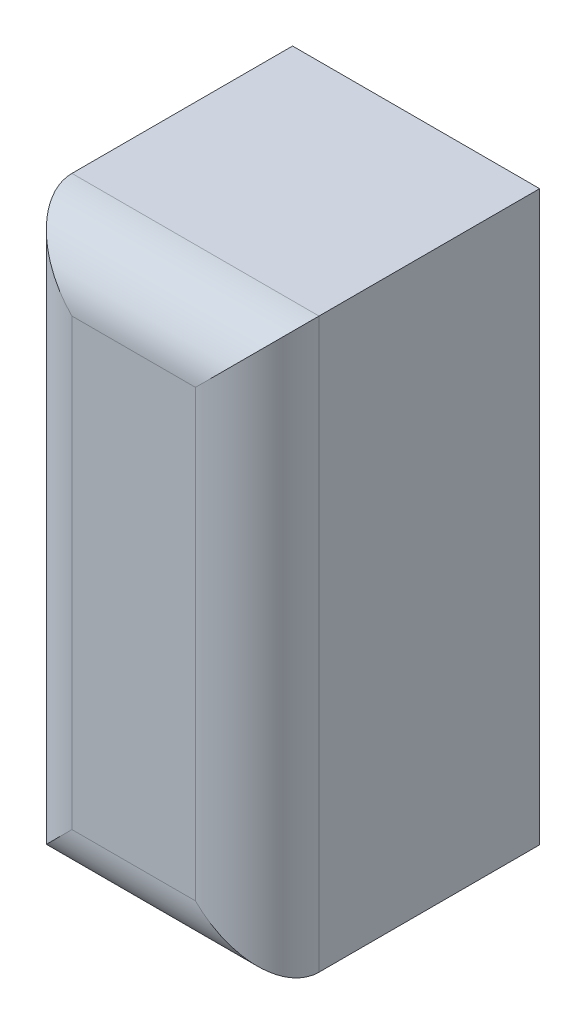
ISO-10303-21;
HEADER;
FILE_DESCRIPTION(('STEP AP214'),'2;1');
FILE_NAME('part.step','',(''),(''),'','','');
FILE_SCHEMA(('AUTOMOTIVE_DESIGN { 1 0 10303 214 1 1 1 1 }'));
ENDSEC;
DATA;
#1=APPLICATION_CONTEXT('core data for automotive mechanical design processes');
#2=APPLICATION_PROTOCOL_DEFINITION('international standard','automotive_design',2000,#1);
#3=PRODUCT_CONTEXT('',#1,'mechanical');
#4=PRODUCT('Part','Part','',(#3));
#5=PRODUCT_RELATED_PRODUCT_CATEGORY('part','',(#4));
#6=PRODUCT_DEFINITION_FORMATION('','',#4);
#7=PRODUCT_DEFINITION_CONTEXT('part definition',#1,'design');
#8=PRODUCT_DEFINITION('design','',#6,#7);
#9=PRODUCT_DEFINITION_SHAPE('','',#8);
#10=(LENGTH_UNIT() NAMED_UNIT(*) SI_UNIT(.MILLI.,.METRE.));
#11=(NAMED_UNIT(*) PLANE_ANGLE_UNIT() SI_UNIT($,.RADIAN.));
#12=(NAMED_UNIT(*) SI_UNIT($,.STERADIAN.) SOLID_ANGLE_UNIT());
#13=UNCERTAINTY_MEASURE_WITH_UNIT(LENGTH_MEASURE(1.E-05),#10,'distance_accuracy_value','');
#14=(GEOMETRIC_REPRESENTATION_CONTEXT(3) GLOBAL_UNCERTAINTY_ASSIGNED_CONTEXT((#13)) GLOBAL_UNIT_ASSIGNED_CONTEXT((#10,
#11,#12)) REPRESENTATION_CONTEXT('',''));
#15=CARTESIAN_POINT('',(0.,0.,0.));
#16=DIRECTION('',(0.,0.,1.));
#17=DIRECTION('',(1.,0.,0.));
#18=AXIS2_PLACEMENT_3D('',#15,#16,#17);
#19=CARTESIAN_POINT('',(9.99999999999999,23.,22.86));
#20=DIRECTION('',(-1.,0.,0.));
#21=DIRECTION('',(0.,-1.,0.));
#22=AXIS2_PLACEMENT_3D('',#19,#20,#21);
#23=PLANE('',#22);
#24=DIRECTION('',(0.,0.,-1.));
#25=VECTOR('',#24,1.);
#26=CARTESIAN_POINT('',(9.99999999999999,23.,22.86));
#27=LINE('',#26,#25);
#28=CARTESIAN_POINT('',(9.99999999999999,23.,17.86));
#29=VERTEX_POINT('',#28);
#30=CARTESIAN_POINT('',(9.99999999999999,23.,0.));
#31=VERTEX_POINT('',#30);
#32=EDGE_CURVE('E98',#29,#31,#27,.T.);
#33=ORIENTED_EDGE('',*,*,#32,.F.);
#34=DIRECTION('',(0.,1.,0.));
#35=VECTOR('',#34,1.);
#36=CARTESIAN_POINT('',(10.,-23.,17.86));
#37=LINE('',#36,#35);
#38=CARTESIAN_POINT('',(10.,-23.,17.86));
#39=VERTEX_POINT('',#38);
#40=EDGE_CURVE('E11',#29,#39,#37,.F.);
#41=ORIENTED_EDGE('',*,*,#40,.T.);
#42=DIRECTION('',(0.,0.,-1.));
#43=VECTOR('',#42,1.);
#44=CARTESIAN_POINT('',(10.,-23.,22.86));
#45=LINE('',#44,#43);
#46=CARTESIAN_POINT('',(10.,-23.,0.));
#47=VERTEX_POINT('',#46);
#48=EDGE_CURVE('E120',#39,#47,#45,.T.);
#49=ORIENTED_EDGE('',*,*,#48,.T.);
#50=DIRECTION('',(0.,1.,0.));
#51=VECTOR('',#50,1.);
#52=CARTESIAN_POINT('',(9.99999999999999,23.,0.));
#53=LINE('',#52,#51);
#54=EDGE_CURVE('E114',#47,#31,#53,.T.);
#55=ORIENTED_EDGE('',*,*,#54,.T.);
#56=EDGE_LOOP('',(#33,#41,#49,#55));
#57=FACE_BOUND('',#56,.T.);
#58=ADVANCED_FACE('F45',(#57),#23,.F.);
#59=CARTESIAN_POINT('',(-10.,23.,22.86));
#60=DIRECTION('',(0.,-1.,0.));
#61=DIRECTION('',(0.,0.,-1.));
#62=AXIS2_PLACEMENT_3D('',#59,#60,#61);
#63=PLANE('',#62);
#64=DIRECTION('',(0.,0.,-1.));
#65=VECTOR('',#64,1.);
#66=CARTESIAN_POINT('',(-10.,23.,22.86));
#67=LINE('',#66,#65);
#68=CARTESIAN_POINT('',(-10.,23.,17.86));
#69=VERTEX_POINT('',#68);
#70=CARTESIAN_POINT('',(-10.,23.,0.));
#71=VERTEX_POINT('',#70);
#72=EDGE_CURVE('E108',#69,#71,#67,.T.);
#73=ORIENTED_EDGE('',*,*,#72,.F.);
#74=DIRECTION('',(-1.,0.,0.));
#75=VECTOR('',#74,1.);
#76=CARTESIAN_POINT('',(9.99999999999999,23.,17.86));
#77=LINE('',#76,#75);
#78=EDGE_CURVE('E55',#69,#29,#77,.F.);
#79=ORIENTED_EDGE('',*,*,#78,.T.);
#80=ORIENTED_EDGE('',*,*,#32,.T.);
#81=DIRECTION('',(-1.,0.,0.));
#82=VECTOR('',#81,1.);
#83=CARTESIAN_POINT('',(-10.,23.,0.));
#84=LINE('',#83,#82);
#85=EDGE_CURVE('E101',#31,#71,#84,.T.);
#86=ORIENTED_EDGE('',*,*,#85,.T.);
#87=EDGE_LOOP('',(#73,#79,#80,#86));
#88=FACE_BOUND('',#87,.T.);
#89=ADVANCED_FACE('F100',(#88),#63,.F.);
#90=CARTESIAN_POINT('',(-10.,23.,22.86));
#91=DIRECTION('',(1.,0.,0.));
#92=DIRECTION('',(0.,1.,0.));
#93=AXIS2_PLACEMENT_3D('',#90,#91,#92);
#94=PLANE('',#93);
#95=DIRECTION('',(0.,0.,-1.));
#96=VECTOR('',#95,1.);
#97=CARTESIAN_POINT('',(-9.99999999999999,-23.,22.86));
#98=LINE('',#97,#96);
#99=CARTESIAN_POINT('',(-9.99999999999999,-23.,17.86));
#100=VERTEX_POINT('',#99);
#101=CARTESIAN_POINT('',(-9.99999999999999,-23.,0.));
#102=VERTEX_POINT('',#101);
#103=EDGE_CURVE('E140',#100,#102,#98,.T.);
#104=ORIENTED_EDGE('',*,*,#103,.F.);
#105=DIRECTION('',(0.,-1.,0.));
#106=VECTOR('',#105,1.);
#107=CARTESIAN_POINT('',(-10.,23.,17.86));
#108=LINE('',#107,#106);
#109=EDGE_CURVE('E70',#100,#69,#108,.F.);
#110=ORIENTED_EDGE('',*,*,#109,.T.);
#111=ORIENTED_EDGE('',*,*,#72,.T.);
#112=DIRECTION('',(0.,-1.,0.));
#113=VECTOR('',#112,1.);
#114=CARTESIAN_POINT('',(-10.,23.,0.));
#115=LINE('',#114,#113);
#116=EDGE_CURVE('E116',#71,#102,#115,.T.);
#117=ORIENTED_EDGE('',*,*,#116,.T.);
#118=EDGE_LOOP('',(#104,#110,#111,#117));
#119=FACE_BOUND('',#118,.T.);
#120=ADVANCED_FACE('F219',(#119),#94,.F.);
#121=CARTESIAN_POINT('',(-9.99999999999999,-23.,22.86));
#122=DIRECTION('',(0.,1.,0.));
#123=DIRECTION('',(0.,0.,1.));
#124=AXIS2_PLACEMENT_3D('',#121,#122,#123);
#125=PLANE('',#124);
#126=ORIENTED_EDGE('',*,*,#48,.F.);
#127=DIRECTION('',(1.,0.,0.));
#128=VECTOR('',#127,1.);
#129=CARTESIAN_POINT('',(-9.99999999999999,-23.,17.86));
#130=LINE('',#129,#128);
#131=EDGE_CURVE('E157',#39,#100,#130,.F.);
#132=ORIENTED_EDGE('',*,*,#131,.T.);
#133=ORIENTED_EDGE('',*,*,#103,.T.);
#134=DIRECTION('',(1.,0.,0.));
#135=VECTOR('',#134,1.);
#136=CARTESIAN_POINT('',(-9.99999999999999,-23.,0.));
#137=LINE('',#136,#135);
#138=EDGE_CURVE('E135',#102,#47,#137,.T.);
#139=ORIENTED_EDGE('',*,*,#138,.T.);
#140=EDGE_LOOP('',(#126,#132,#133,#139));
#141=FACE_BOUND('',#140,.T.);
#142=ADVANCED_FACE('F209',(#141),#125,.F.);
#143=CARTESIAN_POINT('',(0.,0.,22.86));
#144=DIRECTION('',(0.,0.,1.));
#145=DIRECTION('',(1.,0.,0.));
#146=AXIS2_PLACEMENT_3D('',#143,#144,#145);
#147=PLANE('',#146);
#148=DIRECTION('',(0.,-1.,0.));
#149=VECTOR('',#148,1.);
#150=CARTESIAN_POINT('',(-4.99999999999999,-23.,22.86));
#151=LINE('',#150,#149);
#152=CARTESIAN_POINT('',(-5.,18.,22.86));
#153=VERTEX_POINT('',#152);
#154=CARTESIAN_POINT('',(-5.,-18.,22.86));
#155=VERTEX_POINT('',#154);
#156=EDGE_CURVE('E150',#153,#155,#151,.T.);
#157=ORIENTED_EDGE('',*,*,#156,.T.);
#158=DIRECTION('',(1.,0.,0.));
#159=VECTOR('',#158,1.);
#160=CARTESIAN_POINT('',(10.,-18.,22.86));
#161=LINE('',#160,#159);
#162=CARTESIAN_POINT('',(5.,-18.,22.86));
#163=VERTEX_POINT('',#162);
#164=EDGE_CURVE('E153',#155,#163,#161,.T.);
#165=ORIENTED_EDGE('',*,*,#164,.T.);
#166=DIRECTION('',(0.,1.,0.));
#167=VECTOR('',#166,1.);
#168=CARTESIAN_POINT('',(4.99999999999999,23.,22.86));
#169=LINE('',#168,#167);
#170=CARTESIAN_POINT('',(5.,18.,22.86));
#171=VERTEX_POINT('',#170);
#172=EDGE_CURVE('E107',#163,#171,#169,.T.);
#173=ORIENTED_EDGE('',*,*,#172,.T.);
#174=DIRECTION('',(-1.,0.,0.));
#175=VECTOR('',#174,1.);
#176=CARTESIAN_POINT('',(-10.,18.,22.86));
#177=LINE('',#176,#175);
#178=EDGE_CURVE('E147',#171,#153,#177,.T.);
#179=ORIENTED_EDGE('',*,*,#178,.T.);
#180=EDGE_LOOP('',(#157,#165,#173,#179));
#181=FACE_BOUND('',#180,.T.);
#182=ADVANCED_FACE('F200',(#181),#147,.T.);
#183=CARTESIAN_POINT('',(0.,0.,0.));
#184=DIRECTION('',(0.,0.,1.));
#185=DIRECTION('',(1.,0.,0.));
#186=AXIS2_PLACEMENT_3D('',#183,#184,#185);
#187=PLANE('',#186);
#188=CARTESIAN_POINT('',(0.,12.5,0.));
#189=DIRECTION('',(0.,0.,-1.));
#190=DIRECTION('',(-1.,0.,0.));
#191=AXIS2_PLACEMENT_3D('',#188,#189,#190);
#192=CIRCLE('',#191,6.05);
#193=CARTESIAN_POINT('',(-6.04999999999999,12.5,0.));
#194=VERTEX_POINT('',#193);
#195=EDGE_CURVE('E127',#194,#194,#192,.T.);
#196=ORIENTED_EDGE('',*,*,#195,.F.);
#197=EDGE_LOOP('',(#196));
#198=FACE_BOUND('',#197,.T.);
#199=CARTESIAN_POINT('',(0.,-12.5,0.));
#200=DIRECTION('',(0.,0.,-1.));
#201=DIRECTION('',(-1.,0.,0.));
#202=AXIS2_PLACEMENT_3D('',#199,#200,#201);
#203=CIRCLE('',#202,6.05);
#204=CARTESIAN_POINT('',(-6.05,-12.5,0.));
#205=VERTEX_POINT('',#204);
#206=EDGE_CURVE('E183',#205,#205,#203,.T.);
#207=ORIENTED_EDGE('',*,*,#206,.F.);
#208=EDGE_LOOP('',(#207));
#209=FACE_BOUND('',#208,.T.);
#210=ORIENTED_EDGE('',*,*,#54,.F.);
#211=ORIENTED_EDGE('',*,*,#138,.F.);
#212=ORIENTED_EDGE('',*,*,#116,.F.);
#213=ORIENTED_EDGE('',*,*,#85,.F.);
#214=EDGE_LOOP('',(#210,#211,#212,#213));
#215=FACE_BOUND('',#214,.T.);
#216=ADVANCED_FACE('F112',(#198,#209,#215),#187,.F.);
#217=CARTESIAN_POINT('',(0.,-12.5,17.78));
#218=DIRECTION('',(0.,0.,-1.));
#219=DIRECTION('',(-1.,0.,0.));
#220=AXIS2_PLACEMENT_3D('',#217,#218,#219);
#221=CYLINDRICAL_SURFACE('',#220,6.05);
#222=CARTESIAN_POINT('',(0.,-12.5,17.78));
#223=DIRECTION('',(0.,0.,-1.));
#224=DIRECTION('',(-1.,0.,0.));
#225=AXIS2_PLACEMENT_3D('',#222,#223,#224);
#226=CIRCLE('',#225,6.05);
#227=CARTESIAN_POINT('',(-6.05,-12.5,17.78));
#228=VERTEX_POINT('',#227);
#229=EDGE_CURVE('E130',#228,#228,#226,.T.);
#230=ORIENTED_EDGE('',*,*,#229,.F.);
#231=EDGE_LOOP('',(#230));
#232=FACE_BOUND('',#231,.T.);
#233=ORIENTED_EDGE('',*,*,#206,.T.);
#234=EDGE_LOOP('',(#233));
#235=FACE_BOUND('',#234,.T.);
#236=ADVANCED_FACE('F199',(#232,#235),#221,.F.);
#237=CARTESIAN_POINT('',(0.,-12.5,17.78));
#238=DIRECTION('',(0.,0.,-1.));
#239=DIRECTION('',(-1.,0.,0.));
#240=AXIS2_PLACEMENT_3D('',#237,#238,#239);
#241=PLANE('',#240);
#242=ORIENTED_EDGE('',*,*,#229,.T.);
#243=EDGE_LOOP('',(#242));
#244=FACE_BOUND('',#243,.T.);
#245=ADVANCED_FACE('F205',(#244),#241,.T.);
#246=CARTESIAN_POINT('',(0.,12.5,17.78));
#247=DIRECTION('',(0.,0.,-1.));
#248=DIRECTION('',(-1.,0.,0.));
#249=AXIS2_PLACEMENT_3D('',#246,#247,#248);
#250=CYLINDRICAL_SURFACE('',#249,6.05);
#251=CARTESIAN_POINT('',(0.,12.5,17.78));
#252=DIRECTION('',(0.,0.,-1.));
#253=DIRECTION('',(-1.,0.,0.));
#254=AXIS2_PLACEMENT_3D('',#251,#252,#253);
#255=CIRCLE('',#254,6.05);
#256=CARTESIAN_POINT('',(-6.04999999999999,12.5,17.78));
#257=VERTEX_POINT('',#256);
#258=EDGE_CURVE('E123',#257,#257,#255,.T.);
#259=ORIENTED_EDGE('',*,*,#258,.F.);
#260=EDGE_LOOP('',(#259));
#261=FACE_BOUND('',#260,.T.);
#262=ORIENTED_EDGE('',*,*,#195,.T.);
#263=EDGE_LOOP('',(#262));
#264=FACE_BOUND('',#263,.T.);
#265=ADVANCED_FACE('F195',(#261,#264),#250,.F.);
#266=CARTESIAN_POINT('',(0.,12.5,17.78));
#267=DIRECTION('',(0.,0.,-1.));
#268=DIRECTION('',(-1.,0.,0.));
#269=AXIS2_PLACEMENT_3D('',#266,#267,#268);
#270=PLANE('',#269);
#271=ORIENTED_EDGE('',*,*,#258,.T.);
#272=EDGE_LOOP('',(#271));
#273=FACE_BOUND('',#272,.T.);
#274=ADVANCED_FACE('F234',(#273),#270,.T.);
#275=CARTESIAN_POINT('',(0.,18.,17.86));
#276=DIRECTION('',(1.,0.,0.));
#277=DIRECTION('',(0.,0.,-1.));
#278=AXIS2_PLACEMENT_3D('',#275,#276,#277);
#279=CYLINDRICAL_SURFACE('',#278,5.);
#280=CARTESIAN_POINT('',(5.,18.,17.86));
#281=DIRECTION('',(0.707106781186548,-0.707106781186547,0.));
#282=DIRECTION('',(-0.707106781186547,-0.707106781186548,0.));
#283=AXIS2_PLACEMENT_3D('',#280,#281,#282);
#284=ELLIPSE('',#283,7.07106781186547,5.);
#285=EDGE_CURVE('E170',#29,#171,#284,.T.);
#286=ORIENTED_EDGE('',*,*,#285,.F.);
#287=ORIENTED_EDGE('',*,*,#78,.F.);
#288=CARTESIAN_POINT('',(-5.,18.,17.86));
#289=DIRECTION('',(0.707106781186547,0.707106781186548,0.));
#290=DIRECTION('',(0.707106781186548,-0.707106781186547,0.));
#291=AXIS2_PLACEMENT_3D('',#288,#289,#290);
#292=ELLIPSE('',#291,7.07106781186548,5.);
#293=EDGE_CURVE('E49',#153,#69,#292,.F.);
#294=ORIENTED_EDGE('',*,*,#293,.F.);
#295=ORIENTED_EDGE('',*,*,#178,.F.);
#296=EDGE_LOOP('',(#286,#287,#294,#295));
#297=FACE_BOUND('',#296,.T.);
#298=ADVANCED_FACE('F47',(#297),#279,.T.);
#299=CARTESIAN_POINT('',(-5.,0.,17.86));
#300=DIRECTION('',(0.,1.,0.));
#301=DIRECTION('',(-1.,0.,0.));
#302=AXIS2_PLACEMENT_3D('',#299,#300,#301);
#303=CYLINDRICAL_SURFACE('',#302,5.);
#304=ORIENTED_EDGE('',*,*,#293,.T.);
#305=ORIENTED_EDGE('',*,*,#109,.F.);
#306=CARTESIAN_POINT('',(-5.,-18.,17.86));
#307=DIRECTION('',(-0.707106781186548,0.707106781186547,0.));
#308=DIRECTION('',(0.707106781186547,0.707106781186548,0.));
#309=AXIS2_PLACEMENT_3D('',#306,#307,#308);
#310=ELLIPSE('',#309,7.07106781186547,5.);
#311=EDGE_CURVE('E168',#155,#100,#310,.F.);
#312=ORIENTED_EDGE('',*,*,#311,.F.);
#313=ORIENTED_EDGE('',*,*,#156,.F.);
#314=EDGE_LOOP('',(#304,#305,#312,#313));
#315=FACE_BOUND('',#314,.T.);
#316=ADVANCED_FACE('F229',(#315),#303,.T.);
#317=CARTESIAN_POINT('',(5.,0.,17.86));
#318=DIRECTION('',(0.,-1.,0.));
#319=DIRECTION('',(1.,0.,0.));
#320=AXIS2_PLACEMENT_3D('',#317,#318,#319);
#321=CYLINDRICAL_SURFACE('',#320,5.);
#322=ORIENTED_EDGE('',*,*,#285,.T.);
#323=ORIENTED_EDGE('',*,*,#172,.F.);
#324=CARTESIAN_POINT('',(5.,-18.,17.86));
#325=DIRECTION('',(-0.707106781186547,-0.707106781186548,0.));
#326=DIRECTION('',(0.707106781186548,-0.707106781186547,0.));
#327=AXIS2_PLACEMENT_3D('',#324,#325,#326);
#328=ELLIPSE('',#327,7.07106781186548,5.);
#329=EDGE_CURVE('E165',#39,#163,#328,.T.);
#330=ORIENTED_EDGE('',*,*,#329,.F.);
#331=ORIENTED_EDGE('',*,*,#40,.F.);
#332=EDGE_LOOP('',(#322,#323,#330,#331));
#333=FACE_BOUND('',#332,.T.);
#334=ADVANCED_FACE('F226',(#333),#321,.T.);
#335=CARTESIAN_POINT('',(0.,-18.,17.86));
#336=DIRECTION('',(-1.,0.,0.));
#337=DIRECTION('',(0.,0.,1.));
#338=AXIS2_PLACEMENT_3D('',#335,#336,#337);
#339=CYLINDRICAL_SURFACE('',#338,5.);
#340=ORIENTED_EDGE('',*,*,#311,.T.);
#341=ORIENTED_EDGE('',*,*,#131,.F.);
#342=ORIENTED_EDGE('',*,*,#329,.T.);
#343=ORIENTED_EDGE('',*,*,#164,.F.);
#344=EDGE_LOOP('',(#340,#341,#342,#343));
#345=FACE_BOUND('',#344,.T.);
#346=ADVANCED_FACE('F223',(#345),#339,.T.);
#347=CLOSED_SHELL('',(#58,#89,#120,#142,#182,#216,#236,#245,#265,#274,#298,#316,#334,#346));
#348=MANIFOLD_SOLID_BREP('B2',#347);
#349=ADVANCED_BREP_SHAPE_REPRESENTATION('',(#18,#348),#14);
#350=SHAPE_DEFINITION_REPRESENTATION(#9,#349);
ENDSEC;
END-ISO-10303-21;
